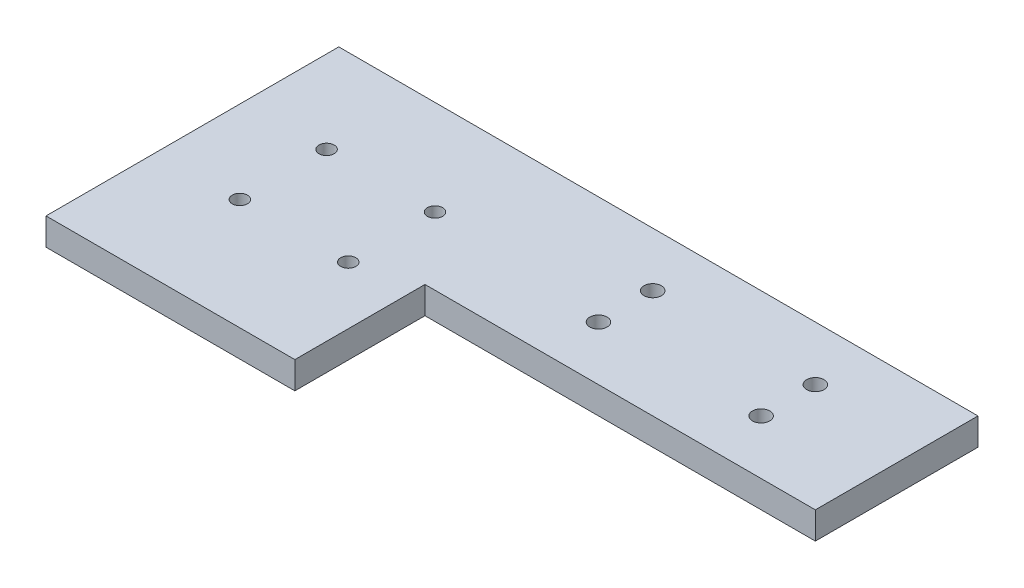
ISO-10303-21;
HEADER;
FILE_DESCRIPTION(('STEP AP214'),'2;1');
FILE_NAME('part.step','',(''),(''),'','','');
FILE_SCHEMA(('AUTOMOTIVE_DESIGN { 1 0 10303 214 1 1 1 1 }'));
ENDSEC;
DATA;
#1=APPLICATION_CONTEXT('core data for automotive mechanical design processes');
#2=APPLICATION_PROTOCOL_DEFINITION('international standard','automotive_design',2000,#1);
#3=PRODUCT_CONTEXT('',#1,'mechanical');
#4=PRODUCT('Part','Part','',(#3));
#5=PRODUCT_RELATED_PRODUCT_CATEGORY('part','',(#4));
#6=PRODUCT_DEFINITION_FORMATION('','',#4);
#7=PRODUCT_DEFINITION_CONTEXT('part definition',#1,'design');
#8=PRODUCT_DEFINITION('design','',#6,#7);
#9=PRODUCT_DEFINITION_SHAPE('','',#8);
#10=(LENGTH_UNIT() NAMED_UNIT(*) SI_UNIT(.MILLI.,.METRE.));
#11=(NAMED_UNIT(*) PLANE_ANGLE_UNIT() SI_UNIT($,.RADIAN.));
#12=(NAMED_UNIT(*) SI_UNIT($,.STERADIAN.) SOLID_ANGLE_UNIT());
#13=UNCERTAINTY_MEASURE_WITH_UNIT(LENGTH_MEASURE(1.E-05),#10,'distance_accuracy_value','');
#14=(GEOMETRIC_REPRESENTATION_CONTEXT(3) GLOBAL_UNCERTAINTY_ASSIGNED_CONTEXT((#13)) GLOBAL_UNIT_ASSIGNED_CONTEXT((#10,
#11,#12)) REPRESENTATION_CONTEXT('',''));
#15=CARTESIAN_POINT('',(0.,0.,0.));
#16=DIRECTION('',(0.,0.,1.));
#17=DIRECTION('',(1.,0.,0.));
#18=AXIS2_PLACEMENT_3D('',#15,#16,#17);
#19=CARTESIAN_POINT('',(-37.9,5.,0.));
#20=DIRECTION('',(1.,0.,0.));
#21=DIRECTION('',(0.,0.,-1.));
#22=AXIS2_PLACEMENT_3D('',#19,#20,#21);
#23=PLANE('',#22);
#24=DIRECTION('',(0.,0.,1.));
#25=VECTOR('',#24,1.);
#26=CARTESIAN_POINT('',(-37.9,0.,0.));
#27=LINE('',#26,#25);
#28=CARTESIAN_POINT('',(-37.9,0.,0.));
#29=VERTEX_POINT('',#28);
#30=CARTESIAN_POINT('',(-37.9,0.,54.));
#31=VERTEX_POINT('',#30);
#32=EDGE_CURVE('E169',#29,#31,#27,.T.);
#33=ORIENTED_EDGE('',*,*,#32,.T.);
#34=DIRECTION('',(0.,-1.,0.));
#35=VECTOR('',#34,1.);
#36=CARTESIAN_POINT('',(-37.9,5.,54.));
#37=LINE('',#36,#35);
#38=CARTESIAN_POINT('',(-37.9,5.,54.));
#39=VERTEX_POINT('',#38);
#40=EDGE_CURVE('E11',#39,#31,#37,.T.);
#41=ORIENTED_EDGE('',*,*,#40,.F.);
#42=DIRECTION('',(0.,0.,1.));
#43=VECTOR('',#42,1.);
#44=CARTESIAN_POINT('',(-37.9,5.,0.));
#45=LINE('',#44,#43);
#46=CARTESIAN_POINT('',(-37.9,5.,0.));
#47=VERTEX_POINT('',#46);
#48=EDGE_CURVE('E221',#47,#39,#45,.T.);
#49=ORIENTED_EDGE('',*,*,#48,.F.);
#50=DIRECTION('',(0.,-1.,0.));
#51=VECTOR('',#50,1.);
#52=CARTESIAN_POINT('',(-37.9,5.,0.));
#53=LINE('',#52,#51);
#54=EDGE_CURVE('E64',#47,#29,#53,.T.);
#55=ORIENTED_EDGE('',*,*,#54,.T.);
#56=EDGE_LOOP('',(#33,#41,#49,#55));
#57=FACE_BOUND('',#56,.T.);
#58=ADVANCED_FACE('F47',(#57),#23,.F.);
#59=CARTESIAN_POINT('',(0.,5.,54.));
#60=DIRECTION('',(0.,0.,-1.));
#61=DIRECTION('',(-1.,0.,0.));
#62=AXIS2_PLACEMENT_3D('',#59,#60,#61);
#63=PLANE('',#62);
#64=DIRECTION('',(1.,0.,0.));
#65=VECTOR('',#64,1.);
#66=CARTESIAN_POINT('',(0.,0.,54.));
#67=LINE('',#66,#65);
#68=CARTESIAN_POINT('',(8.00000000000001,0.,54.));
#69=VERTEX_POINT('',#68);
#70=EDGE_CURVE('E172',#31,#69,#67,.T.);
#71=ORIENTED_EDGE('',*,*,#70,.T.);
#72=DIRECTION('',(0.,-1.,0.));
#73=VECTOR('',#72,1.);
#74=CARTESIAN_POINT('',(8.00000000000001,5.,54.));
#75=LINE('',#74,#73);
#76=CARTESIAN_POINT('',(8.00000000000001,5.,54.));
#77=VERTEX_POINT('',#76);
#78=EDGE_CURVE('E56',#77,#69,#75,.T.);
#79=ORIENTED_EDGE('',*,*,#78,.F.);
#80=DIRECTION('',(1.,0.,0.));
#81=VECTOR('',#80,1.);
#82=CARTESIAN_POINT('',(0.,5.,54.));
#83=LINE('',#82,#81);
#84=EDGE_CURVE('E96',#39,#77,#83,.T.);
#85=ORIENTED_EDGE('',*,*,#84,.F.);
#86=ORIENTED_EDGE('',*,*,#40,.T.);
#87=EDGE_LOOP('',(#71,#79,#85,#86));
#88=FACE_BOUND('',#87,.T.);
#89=ADVANCED_FACE('F231',(#88),#63,.F.);
#90=CARTESIAN_POINT('',(8.,5.,0.));
#91=DIRECTION('',(1.,0.,0.));
#92=DIRECTION('',(0.,0.,-1.));
#93=AXIS2_PLACEMENT_3D('',#90,#91,#92);
#94=PLANE('',#93);
#95=DIRECTION('',(0.,0.,1.));
#96=VECTOR('',#95,1.);
#97=CARTESIAN_POINT('',(8.,0.,0.));
#98=LINE('',#97,#96);
#99=CARTESIAN_POINT('',(8.,0.,30.));
#100=VERTEX_POINT('',#99);
#101=EDGE_CURVE('E176',#100,#69,#98,.T.);
#102=ORIENTED_EDGE('',*,*,#101,.F.);
#103=DIRECTION('',(0.,-1.,0.));
#104=VECTOR('',#103,1.);
#105=CARTESIAN_POINT('',(8.,5.,30.));
#106=LINE('',#105,#104);
#107=CARTESIAN_POINT('',(8.,5.,30.));
#108=VERTEX_POINT('',#107);
#109=EDGE_CURVE('E127',#108,#100,#106,.T.);
#110=ORIENTED_EDGE('',*,*,#109,.F.);
#111=DIRECTION('',(0.,0.,1.));
#112=VECTOR('',#111,1.);
#113=CARTESIAN_POINT('',(8.,5.,0.));
#114=LINE('',#113,#112);
#115=EDGE_CURVE('E115',#108,#77,#114,.T.);
#116=ORIENTED_EDGE('',*,*,#115,.T.);
#117=ORIENTED_EDGE('',*,*,#78,.T.);
#118=EDGE_LOOP('',(#102,#110,#116,#117));
#119=FACE_BOUND('',#118,.T.);
#120=ADVANCED_FACE('F230',(#119),#94,.T.);
#121=CARTESIAN_POINT('',(0.,5.,30.));
#122=DIRECTION('',(0.,0.,-1.));
#123=DIRECTION('',(-1.,0.,0.));
#124=AXIS2_PLACEMENT_3D('',#121,#122,#123);
#125=PLANE('',#124);
#126=DIRECTION('',(1.,0.,0.));
#127=VECTOR('',#126,1.);
#128=CARTESIAN_POINT('',(0.,0.,30.));
#129=LINE('',#128,#127);
#130=CARTESIAN_POINT('',(80.,0.,30.));
#131=VERTEX_POINT('',#130);
#132=EDGE_CURVE('E123',#100,#131,#129,.T.);
#133=ORIENTED_EDGE('',*,*,#132,.T.);
#134=DIRECTION('',(0.,-1.,0.));
#135=VECTOR('',#134,1.);
#136=CARTESIAN_POINT('',(80.,5.,30.));
#137=LINE('',#136,#135);
#138=CARTESIAN_POINT('',(80.,5.,30.));
#139=VERTEX_POINT('',#138);
#140=EDGE_CURVE('E120',#139,#131,#137,.T.);
#141=ORIENTED_EDGE('',*,*,#140,.F.);
#142=DIRECTION('',(1.,0.,0.));
#143=VECTOR('',#142,1.);
#144=CARTESIAN_POINT('',(0.,5.,30.));
#145=LINE('',#144,#143);
#146=EDGE_CURVE('E107',#108,#139,#145,.T.);
#147=ORIENTED_EDGE('',*,*,#146,.F.);
#148=ORIENTED_EDGE('',*,*,#109,.T.);
#149=EDGE_LOOP('',(#133,#141,#147,#148));
#150=FACE_BOUND('',#149,.T.);
#151=ADVANCED_FACE('F121',(#150),#125,.F.);
#152=CARTESIAN_POINT('',(80.,5.,0.));
#153=DIRECTION('',(1.,0.,0.));
#154=DIRECTION('',(0.,0.,-1.));
#155=AXIS2_PLACEMENT_3D('',#152,#153,#154);
#156=PLANE('',#155);
#157=DIRECTION('',(0.,0.,1.));
#158=VECTOR('',#157,1.);
#159=CARTESIAN_POINT('',(80.,0.,0.));
#160=LINE('',#159,#158);
#161=CARTESIAN_POINT('',(80.,0.,0.));
#162=VERTEX_POINT('',#161);
#163=EDGE_CURVE('E182',#162,#131,#160,.T.);
#164=ORIENTED_EDGE('',*,*,#163,.F.);
#165=DIRECTION('',(0.,-1.,0.));
#166=VECTOR('',#165,1.);
#167=CARTESIAN_POINT('',(80.,5.,0.));
#168=LINE('',#167,#166);
#169=CARTESIAN_POINT('',(80.,5.,0.));
#170=VERTEX_POINT('',#169);
#171=EDGE_CURVE('E84',#170,#162,#168,.T.);
#172=ORIENTED_EDGE('',*,*,#171,.F.);
#173=DIRECTION('',(0.,0.,1.));
#174=VECTOR('',#173,1.);
#175=CARTESIAN_POINT('',(80.,5.,0.));
#176=LINE('',#175,#174);
#177=EDGE_CURVE('E113',#170,#139,#176,.T.);
#178=ORIENTED_EDGE('',*,*,#177,.T.);
#179=ORIENTED_EDGE('',*,*,#140,.T.);
#180=EDGE_LOOP('',(#164,#172,#178,#179));
#181=FACE_BOUND('',#180,.T.);
#182=ADVANCED_FACE('F129',(#181),#156,.T.);
#183=CARTESIAN_POINT('',(-2.64999999999999,5.,17.5));
#184=DIRECTION('',(0.,-1.,0.));
#185=DIRECTION('',(0.,0.,-1.));
#186=AXIS2_PLACEMENT_3D('',#183,#184,#185);
#187=CYLINDRICAL_SURFACE('',#186,1.4);
#188=CARTESIAN_POINT('',(-2.64999999999999,5.,17.5));
#189=DIRECTION('',(0.,1.,0.));
#190=DIRECTION('',(0.,0.,1.));
#191=AXIS2_PLACEMENT_3D('',#188,#189,#190);
#192=CIRCLE('',#191,1.4);
#193=CARTESIAN_POINT('',(-2.64999999999999,5.,18.9));
#194=VERTEX_POINT('',#193);
#195=EDGE_CURVE('E161',#194,#194,#192,.T.);
#196=ORIENTED_EDGE('',*,*,#195,.T.);
#197=EDGE_LOOP('',(#196));
#198=FACE_BOUND('',#197,.T.);
#199=CARTESIAN_POINT('',(-2.64999999999999,0.,17.5));
#200=DIRECTION('',(0.,1.,0.));
#201=DIRECTION('',(0.,0.,1.));
#202=AXIS2_PLACEMENT_3D('',#199,#200,#201);
#203=CIRCLE('',#202,1.4);
#204=CARTESIAN_POINT('',(-2.64999999999999,0.,18.9));
#205=VERTEX_POINT('',#204);
#206=EDGE_CURVE('E213',#205,#205,#203,.T.);
#207=ORIENTED_EDGE('',*,*,#206,.F.);
#208=EDGE_LOOP('',(#207));
#209=FACE_BOUND('',#208,.T.);
#210=ADVANCED_FACE('F267',(#198,#209),#187,.F.);
#211=CARTESIAN_POINT('',(-2.64999999999983,5.,33.5));
#212=DIRECTION('',(0.,-1.,0.));
#213=DIRECTION('',(0.,0.,-1.));
#214=AXIS2_PLACEMENT_3D('',#211,#212,#213);
#215=CYLINDRICAL_SURFACE('',#214,1.4);
#216=CARTESIAN_POINT('',(-2.64999999999983,5.,33.5));
#217=DIRECTION('',(0.,1.,0.));
#218=DIRECTION('',(0.,0.,1.));
#219=AXIS2_PLACEMENT_3D('',#216,#217,#218);
#220=CIRCLE('',#219,1.4);
#221=CARTESIAN_POINT('',(-2.64999999999983,5.,34.9));
#222=VERTEX_POINT('',#221);
#223=EDGE_CURVE('E157',#222,#222,#220,.T.);
#224=ORIENTED_EDGE('',*,*,#223,.T.);
#225=EDGE_LOOP('',(#224));
#226=FACE_BOUND('',#225,.T.);
#227=CARTESIAN_POINT('',(-2.64999999999983,0.,33.5));
#228=DIRECTION('',(0.,1.,0.));
#229=DIRECTION('',(0.,0.,1.));
#230=AXIS2_PLACEMENT_3D('',#227,#228,#229);
#231=CIRCLE('',#230,1.4);
#232=CARTESIAN_POINT('',(-2.64999999999983,0.,34.9));
#233=VERTEX_POINT('',#232);
#234=EDGE_CURVE('E209',#233,#233,#231,.T.);
#235=ORIENTED_EDGE('',*,*,#234,.F.);
#236=EDGE_LOOP('',(#235));
#237=FACE_BOUND('',#236,.T.);
#238=ADVANCED_FACE('F271',(#226,#237),#215,.F.);
#239=CARTESIAN_POINT('',(-22.6499999999998,5.,33.5));
#240=DIRECTION('',(0.,-1.,0.));
#241=DIRECTION('',(0.,0.,-1.));
#242=AXIS2_PLACEMENT_3D('',#239,#240,#241);
#243=CYLINDRICAL_SURFACE('',#242,1.4);
#244=CARTESIAN_POINT('',(-22.6499999999998,5.,33.5));
#245=DIRECTION('',(0.,1.,0.));
#246=DIRECTION('',(0.,0.,1.));
#247=AXIS2_PLACEMENT_3D('',#244,#245,#246);
#248=CIRCLE('',#247,1.4);
#249=CARTESIAN_POINT('',(-22.6499999999998,5.,34.9));
#250=VERTEX_POINT('',#249);
#251=EDGE_CURVE('E153',#250,#250,#248,.T.);
#252=ORIENTED_EDGE('',*,*,#251,.T.);
#253=EDGE_LOOP('',(#252));
#254=FACE_BOUND('',#253,.T.);
#255=CARTESIAN_POINT('',(-22.6499999999998,0.,33.5));
#256=DIRECTION('',(0.,1.,0.));
#257=DIRECTION('',(0.,0.,1.));
#258=AXIS2_PLACEMENT_3D('',#255,#256,#257);
#259=CIRCLE('',#258,1.4);
#260=CARTESIAN_POINT('',(-22.6499999999998,0.,34.9));
#261=VERTEX_POINT('',#260);
#262=EDGE_CURVE('E205',#261,#261,#259,.T.);
#263=ORIENTED_EDGE('',*,*,#262,.F.);
#264=EDGE_LOOP('',(#263));
#265=FACE_BOUND('',#264,.T.);
#266=ADVANCED_FACE('F277',(#254,#265),#243,.F.);
#267=CARTESIAN_POINT('',(30.,5.,20.));
#268=DIRECTION('',(0.,-1.,0.));
#269=DIRECTION('',(0.,0.,-1.));
#270=AXIS2_PLACEMENT_3D('',#267,#268,#269);
#271=CYLINDRICAL_SURFACE('',#270,1.6);
#272=CARTESIAN_POINT('',(30.,5.,20.));
#273=DIRECTION('',(0.,1.,0.));
#274=DIRECTION('',(0.,0.,1.));
#275=AXIS2_PLACEMENT_3D('',#272,#273,#274);
#276=CIRCLE('',#275,1.6);
#277=CARTESIAN_POINT('',(30.,5.,21.6));
#278=VERTEX_POINT('',#277);
#279=EDGE_CURVE('E149',#278,#278,#276,.T.);
#280=ORIENTED_EDGE('',*,*,#279,.T.);
#281=EDGE_LOOP('',(#280));
#282=FACE_BOUND('',#281,.T.);
#283=CARTESIAN_POINT('',(30.,0.,20.));
#284=DIRECTION('',(0.,1.,0.));
#285=DIRECTION('',(0.,0.,1.));
#286=AXIS2_PLACEMENT_3D('',#283,#284,#285);
#287=CIRCLE('',#286,1.6);
#288=CARTESIAN_POINT('',(30.,0.,21.6));
#289=VERTEX_POINT('',#288);
#290=EDGE_CURVE('E201',#289,#289,#287,.T.);
#291=ORIENTED_EDGE('',*,*,#290,.F.);
#292=EDGE_LOOP('',(#291));
#293=FACE_BOUND('',#292,.T.);
#294=ADVANCED_FACE('F285',(#282,#293),#271,.F.);
#295=CARTESIAN_POINT('',(60.,5.,20.));
#296=DIRECTION('',(0.,-1.,0.));
#297=DIRECTION('',(0.,0.,-1.));
#298=AXIS2_PLACEMENT_3D('',#295,#296,#297);
#299=CYLINDRICAL_SURFACE('',#298,1.6);
#300=CARTESIAN_POINT('',(60.,5.,20.));
#301=DIRECTION('',(0.,1.,0.));
#302=DIRECTION('',(0.,0.,1.));
#303=AXIS2_PLACEMENT_3D('',#300,#301,#302);
#304=CIRCLE('',#303,1.6);
#305=CARTESIAN_POINT('',(60.,5.,21.6));
#306=VERTEX_POINT('',#305);
#307=EDGE_CURVE('E145',#306,#306,#304,.T.);
#308=ORIENTED_EDGE('',*,*,#307,.T.);
#309=EDGE_LOOP('',(#308));
#310=FACE_BOUND('',#309,.T.);
#311=CARTESIAN_POINT('',(60.,0.,20.));
#312=DIRECTION('',(0.,1.,0.));
#313=DIRECTION('',(0.,0.,1.));
#314=AXIS2_PLACEMENT_3D('',#311,#312,#313);
#315=CIRCLE('',#314,1.6);
#316=CARTESIAN_POINT('',(60.,0.,21.6));
#317=VERTEX_POINT('',#316);
#318=EDGE_CURVE('E197',#317,#317,#315,.T.);
#319=ORIENTED_EDGE('',*,*,#318,.F.);
#320=EDGE_LOOP('',(#319));
#321=FACE_BOUND('',#320,.T.);
#322=ADVANCED_FACE('F289',(#310,#321),#299,.F.);
#323=CARTESIAN_POINT('',(60.,5.,10.));
#324=DIRECTION('',(0.,-1.,0.));
#325=DIRECTION('',(0.,0.,-1.));
#326=AXIS2_PLACEMENT_3D('',#323,#324,#325);
#327=CYLINDRICAL_SURFACE('',#326,1.6);
#328=CARTESIAN_POINT('',(60.,5.,10.));
#329=DIRECTION('',(0.,1.,0.));
#330=DIRECTION('',(0.,0.,1.));
#331=AXIS2_PLACEMENT_3D('',#328,#329,#330);
#332=CIRCLE('',#331,1.6);
#333=CARTESIAN_POINT('',(60.,5.,11.6));
#334=VERTEX_POINT('',#333);
#335=EDGE_CURVE('E141',#334,#334,#332,.T.);
#336=ORIENTED_EDGE('',*,*,#335,.T.);
#337=EDGE_LOOP('',(#336));
#338=FACE_BOUND('',#337,.T.);
#339=CARTESIAN_POINT('',(60.,0.,10.));
#340=DIRECTION('',(0.,1.,0.));
#341=DIRECTION('',(0.,0.,1.));
#342=AXIS2_PLACEMENT_3D('',#339,#340,#341);
#343=CIRCLE('',#342,1.6);
#344=CARTESIAN_POINT('',(60.,0.,11.6));
#345=VERTEX_POINT('',#344);
#346=EDGE_CURVE('E193',#345,#345,#343,.T.);
#347=ORIENTED_EDGE('',*,*,#346,.F.);
#348=EDGE_LOOP('',(#347));
#349=FACE_BOUND('',#348,.T.);
#350=ADVANCED_FACE('F247',(#338,#349),#327,.F.);
#351=CARTESIAN_POINT('',(30.,5.,10.));
#352=DIRECTION('',(0.,-1.,0.));
#353=DIRECTION('',(0.,0.,-1.));
#354=AXIS2_PLACEMENT_3D('',#351,#352,#353);
#355=CYLINDRICAL_SURFACE('',#354,1.6);
#356=CARTESIAN_POINT('',(30.,5.,10.));
#357=DIRECTION('',(0.,1.,0.));
#358=DIRECTION('',(0.,0.,1.));
#359=AXIS2_PLACEMENT_3D('',#356,#357,#358);
#360=CIRCLE('',#359,1.6);
#361=CARTESIAN_POINT('',(30.,5.,11.6));
#362=VERTEX_POINT('',#361);
#363=EDGE_CURVE('E134',#362,#362,#360,.T.);
#364=ORIENTED_EDGE('',*,*,#363,.T.);
#365=EDGE_LOOP('',(#364));
#366=FACE_BOUND('',#365,.T.);
#367=CARTESIAN_POINT('',(30.,0.,10.));
#368=DIRECTION('',(0.,1.,0.));
#369=DIRECTION('',(0.,0.,1.));
#370=AXIS2_PLACEMENT_3D('',#367,#368,#369);
#371=CIRCLE('',#370,1.6);
#372=CARTESIAN_POINT('',(30.,0.,11.6));
#373=VERTEX_POINT('',#372);
#374=EDGE_CURVE('E189',#373,#373,#371,.T.);
#375=ORIENTED_EDGE('',*,*,#374,.F.);
#376=EDGE_LOOP('',(#375));
#377=FACE_BOUND('',#376,.T.);
#378=ADVANCED_FACE('F239',(#366,#377),#355,.F.);
#379=CARTESIAN_POINT('',(0.,5.,0.));
#380=DIRECTION('',(0.,0.,-1.));
#381=DIRECTION('',(-1.,0.,0.));
#382=AXIS2_PLACEMENT_3D('',#379,#380,#381);
#383=PLANE('',#382);
#384=DIRECTION('',(1.,0.,0.));
#385=VECTOR('',#384,1.);
#386=CARTESIAN_POINT('',(0.,0.,0.));
#387=LINE('',#386,#385);
#388=EDGE_CURVE('E185',#29,#162,#387,.T.);
#389=ORIENTED_EDGE('',*,*,#388,.F.);
#390=ORIENTED_EDGE('',*,*,#54,.F.);
#391=DIRECTION('',(1.,0.,0.));
#392=VECTOR('',#391,1.);
#393=CARTESIAN_POINT('',(0.,5.,0.));
#394=LINE('',#393,#392);
#395=EDGE_CURVE('E131',#47,#170,#394,.T.);
#396=ORIENTED_EDGE('',*,*,#395,.T.);
#397=ORIENTED_EDGE('',*,*,#171,.T.);
#398=EDGE_LOOP('',(#389,#390,#396,#397));
#399=FACE_BOUND('',#398,.T.);
#400=ADVANCED_FACE('F236',(#399),#383,.T.);
#401=CARTESIAN_POINT('',(-22.65,5.,17.5));
#402=DIRECTION('',(0.,-1.,0.));
#403=DIRECTION('',(0.,0.,-1.));
#404=AXIS2_PLACEMENT_3D('',#401,#402,#403);
#405=CYLINDRICAL_SURFACE('',#404,1.4);
#406=CARTESIAN_POINT('',(-22.65,5.,17.5));
#407=DIRECTION('',(0.,1.,0.));
#408=DIRECTION('',(0.,0.,1.));
#409=AXIS2_PLACEMENT_3D('',#406,#407,#408);
#410=CIRCLE('',#409,1.4);
#411=CARTESIAN_POINT('',(-22.65,5.,18.9));
#412=VERTEX_POINT('',#411);
#413=EDGE_CURVE('E165',#412,#412,#410,.T.);
#414=ORIENTED_EDGE('',*,*,#413,.T.);
#415=EDGE_LOOP('',(#414));
#416=FACE_BOUND('',#415,.T.);
#417=CARTESIAN_POINT('',(-22.65,0.,17.5));
#418=DIRECTION('',(0.,1.,0.));
#419=DIRECTION('',(0.,0.,1.));
#420=AXIS2_PLACEMENT_3D('',#417,#418,#419);
#421=CIRCLE('',#420,1.4);
#422=CARTESIAN_POINT('',(-22.65,0.,18.9));
#423=VERTEX_POINT('',#422);
#424=EDGE_CURVE('E217',#423,#423,#421,.T.);
#425=ORIENTED_EDGE('',*,*,#424,.F.);
#426=EDGE_LOOP('',(#425));
#427=FACE_BOUND('',#426,.T.);
#428=ADVANCED_FACE('F238',(#416,#427),#405,.F.);
#429=CARTESIAN_POINT('',(0.,5.,0.));
#430=DIRECTION('',(0.,1.,0.));
#431=DIRECTION('',(0.,0.,1.));
#432=AXIS2_PLACEMENT_3D('',#429,#430,#431);
#433=PLANE('',#432);
#434=ORIENTED_EDGE('',*,*,#48,.T.);
#435=ORIENTED_EDGE('',*,*,#84,.T.);
#436=ORIENTED_EDGE('',*,*,#115,.F.);
#437=ORIENTED_EDGE('',*,*,#146,.T.);
#438=ORIENTED_EDGE('',*,*,#177,.F.);
#439=ORIENTED_EDGE('',*,*,#395,.F.);
#440=EDGE_LOOP('',(#434,#435,#436,#437,#438,#439));
#441=FACE_BOUND('',#440,.T.);
#442=ORIENTED_EDGE('',*,*,#363,.F.);
#443=EDGE_LOOP('',(#442));
#444=FACE_BOUND('',#443,.T.);
#445=ORIENTED_EDGE('',*,*,#335,.F.);
#446=EDGE_LOOP('',(#445));
#447=FACE_BOUND('',#446,.T.);
#448=ORIENTED_EDGE('',*,*,#307,.F.);
#449=EDGE_LOOP('',(#448));
#450=FACE_BOUND('',#449,.T.);
#451=ORIENTED_EDGE('',*,*,#279,.F.);
#452=EDGE_LOOP('',(#451));
#453=FACE_BOUND('',#452,.T.);
#454=ORIENTED_EDGE('',*,*,#251,.F.);
#455=EDGE_LOOP('',(#454));
#456=FACE_BOUND('',#455,.T.);
#457=ORIENTED_EDGE('',*,*,#223,.F.);
#458=EDGE_LOOP('',(#457));
#459=FACE_BOUND('',#458,.T.);
#460=ORIENTED_EDGE('',*,*,#195,.F.);
#461=EDGE_LOOP('',(#460));
#462=FACE_BOUND('',#461,.T.);
#463=ORIENTED_EDGE('',*,*,#413,.F.);
#464=EDGE_LOOP('',(#463));
#465=FACE_BOUND('',#464,.T.);
#466=ADVANCED_FACE('F109',(#441,#444,#447,#450,#453,#456,#459,#462,#465),#433,.T.);
#467=CARTESIAN_POINT('',(0.,0.,0.));
#468=DIRECTION('',(0.,1.,0.));
#469=DIRECTION('',(0.,0.,1.));
#470=AXIS2_PLACEMENT_3D('',#467,#468,#469);
#471=PLANE('',#470);
#472=ORIENTED_EDGE('',*,*,#32,.F.);
#473=ORIENTED_EDGE('',*,*,#388,.T.);
#474=ORIENTED_EDGE('',*,*,#163,.T.);
#475=ORIENTED_EDGE('',*,*,#132,.F.);
#476=ORIENTED_EDGE('',*,*,#101,.T.);
#477=ORIENTED_EDGE('',*,*,#70,.F.);
#478=EDGE_LOOP('',(#472,#473,#474,#475,#476,#477));
#479=FACE_BOUND('',#478,.T.);
#480=ORIENTED_EDGE('',*,*,#374,.T.);
#481=EDGE_LOOP('',(#480));
#482=FACE_BOUND('',#481,.T.);
#483=ORIENTED_EDGE('',*,*,#346,.T.);
#484=EDGE_LOOP('',(#483));
#485=FACE_BOUND('',#484,.T.);
#486=ORIENTED_EDGE('',*,*,#318,.T.);
#487=EDGE_LOOP('',(#486));
#488=FACE_BOUND('',#487,.T.);
#489=ORIENTED_EDGE('',*,*,#290,.T.);
#490=EDGE_LOOP('',(#489));
#491=FACE_BOUND('',#490,.T.);
#492=ORIENTED_EDGE('',*,*,#262,.T.);
#493=EDGE_LOOP('',(#492));
#494=FACE_BOUND('',#493,.T.);
#495=ORIENTED_EDGE('',*,*,#234,.T.);
#496=EDGE_LOOP('',(#495));
#497=FACE_BOUND('',#496,.T.);
#498=ORIENTED_EDGE('',*,*,#206,.T.);
#499=EDGE_LOOP('',(#498));
#500=FACE_BOUND('',#499,.T.);
#501=ORIENTED_EDGE('',*,*,#424,.T.);
#502=EDGE_LOOP('',(#501));
#503=FACE_BOUND('',#502,.T.);
#504=ADVANCED_FACE('F234',(#479,#482,#485,#488,#491,#494,#497,#500,#503),#471,.F.);
#505=CLOSED_SHELL('',(#58,#89,#120,#151,#182,#210,#238,#266,#294,#322,#350,#378,#400,#428,#466,#504));
#506=MANIFOLD_SOLID_BREP('B2',#505);
#507=ADVANCED_BREP_SHAPE_REPRESENTATION('',(#18,#506),#14);
#508=SHAPE_DEFINITION_REPRESENTATION(#9,#507);
ENDSEC;
END-ISO-10303-21;
